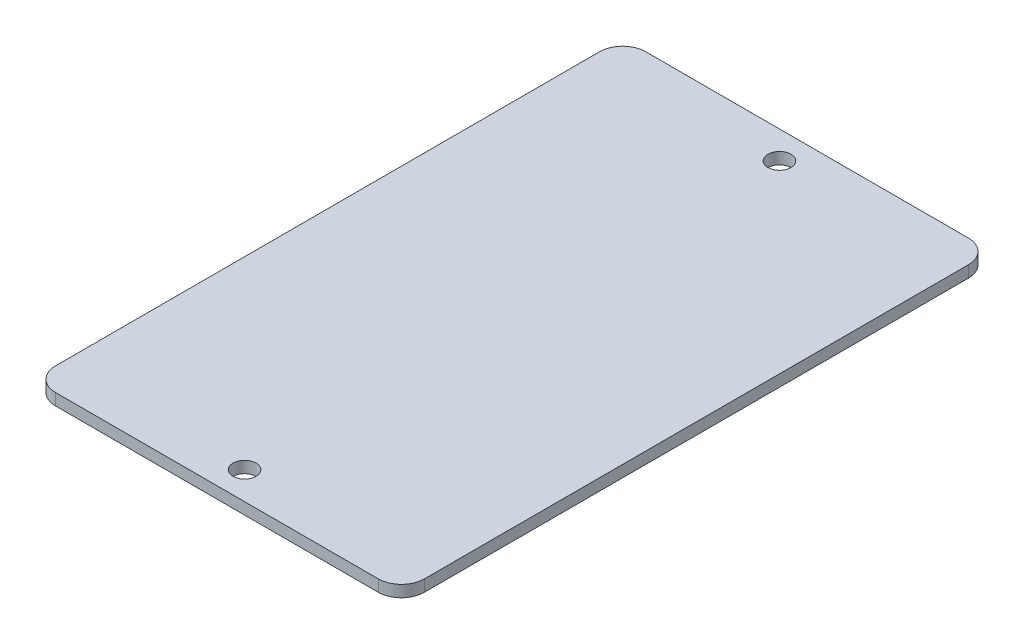
ISO-10303-21;
HEADER;
FILE_DESCRIPTION(('STEP AP214'),'2;1');
FILE_NAME('part.step','',(''),(''),'','','');
FILE_SCHEMA(('AUTOMOTIVE_DESIGN { 1 0 10303 214 1 1 1 1 }'));
ENDSEC;
DATA;
#1=APPLICATION_CONTEXT('core data for automotive mechanical design processes');
#2=APPLICATION_PROTOCOL_DEFINITION('international standard','automotive_design',2000,#1);
#3=PRODUCT_CONTEXT('',#1,'mechanical');
#4=PRODUCT('Part','Part','',(#3));
#5=PRODUCT_RELATED_PRODUCT_CATEGORY('part','',(#4));
#6=PRODUCT_DEFINITION_FORMATION('','',#4);
#7=PRODUCT_DEFINITION_CONTEXT('part definition',#1,'design');
#8=PRODUCT_DEFINITION('design','',#6,#7);
#9=PRODUCT_DEFINITION_SHAPE('','',#8);
#10=(LENGTH_UNIT() NAMED_UNIT(*) SI_UNIT(.MILLI.,.METRE.));
#11=(NAMED_UNIT(*) PLANE_ANGLE_UNIT() SI_UNIT($,.RADIAN.));
#12=(NAMED_UNIT(*) SI_UNIT($,.STERADIAN.) SOLID_ANGLE_UNIT());
#13=UNCERTAINTY_MEASURE_WITH_UNIT(LENGTH_MEASURE(1.E-05),#10,'distance_accuracy_value','');
#14=(GEOMETRIC_REPRESENTATION_CONTEXT(3) GLOBAL_UNCERTAINTY_ASSIGNED_CONTEXT((#13)) GLOBAL_UNIT_ASSIGNED_CONTEXT((#10,
#11,#12)) REPRESENTATION_CONTEXT('',''));
#15=CARTESIAN_POINT('',(0.,0.,0.));
#16=DIRECTION('',(0.,0.,1.));
#17=DIRECTION('',(1.,0.,0.));
#18=AXIS2_PLACEMENT_3D('',#15,#16,#17);
#19=CARTESIAN_POINT('',(25.4,0.8001,40.64));
#20=DIRECTION('',(-1.,0.,0.));
#21=DIRECTION('',(0.,0.,1.));
#22=AXIS2_PLACEMENT_3D('',#19,#20,#21);
#23=PLANE('',#22);
#24=DIRECTION('',(0.,0.,-1.));
#25=VECTOR('',#24,1.);
#26=CARTESIAN_POINT('',(25.4,0.8001,40.64));
#27=LINE('',#26,#25);
#28=CARTESIAN_POINT('',(25.4,0.8001,37.465));
#29=VERTEX_POINT('',#28);
#30=CARTESIAN_POINT('',(25.4,0.8001,-37.465));
#31=VERTEX_POINT('',#30);
#32=EDGE_CURVE('E119',#29,#31,#27,.T.);
#33=ORIENTED_EDGE('',*,*,#32,.F.);
#34=DIRECTION('',(0.,-1.,0.));
#35=VECTOR('',#34,1.);
#36=CARTESIAN_POINT('',(25.4,0.8001,37.465));
#37=LINE('',#36,#35);
#38=CARTESIAN_POINT('',(25.4,-0.8001,37.465));
#39=VERTEX_POINT('',#38);
#40=EDGE_CURVE('E104',#29,#39,#37,.T.);
#41=ORIENTED_EDGE('',*,*,#40,.T.);
#42=DIRECTION('',(0.,0.,-1.));
#43=VECTOR('',#42,1.);
#44=CARTESIAN_POINT('',(25.4,-0.8001,40.64));
#45=LINE('',#44,#43);
#46=CARTESIAN_POINT('',(25.4,-0.8001,-37.465));
#47=VERTEX_POINT('',#46);
#48=EDGE_CURVE('E116',#39,#47,#45,.T.);
#49=ORIENTED_EDGE('',*,*,#48,.T.);
#50=DIRECTION('',(0.,-1.,0.));
#51=VECTOR('',#50,1.);
#52=CARTESIAN_POINT('',(25.4,0.8001,-37.465));
#53=LINE('',#52,#51);
#54=EDGE_CURVE('E121',#47,#31,#53,.F.);
#55=ORIENTED_EDGE('',*,*,#54,.T.);
#56=EDGE_LOOP('',(#33,#41,#49,#55));
#57=FACE_BOUND('',#56,.T.);
#58=ADVANCED_FACE('F33',(#57),#23,.F.);
#59=CARTESIAN_POINT('',(-25.4,0.8001,-40.64));
#60=DIRECTION('',(0.,0.,1.));
#61=DIRECTION('',(1.,0.,0.));
#62=AXIS2_PLACEMENT_3D('',#59,#60,#61);
#63=PLANE('',#62);
#64=DIRECTION('',(-1.,0.,0.));
#65=VECTOR('',#64,1.);
#66=CARTESIAN_POINT('',(-25.4,0.8001,-40.64));
#67=LINE('',#66,#65);
#68=CARTESIAN_POINT('',(22.225,0.8001,-40.64));
#69=VERTEX_POINT('',#68);
#70=CARTESIAN_POINT('',(-22.225,0.8001,-40.64));
#71=VERTEX_POINT('',#70);
#72=EDGE_CURVE('E163',#69,#71,#67,.T.);
#73=ORIENTED_EDGE('',*,*,#72,.F.);
#74=DIRECTION('',(0.,-1.,0.));
#75=VECTOR('',#74,1.);
#76=CARTESIAN_POINT('',(22.225,0.8001,-40.64));
#77=LINE('',#76,#75);
#78=CARTESIAN_POINT('',(22.225,-0.8001,-40.64));
#79=VERTEX_POINT('',#78);
#80=EDGE_CURVE('E11',#69,#79,#77,.T.);
#81=ORIENTED_EDGE('',*,*,#80,.T.);
#82=DIRECTION('',(-1.,0.,0.));
#83=VECTOR('',#82,1.);
#84=CARTESIAN_POINT('',(-25.4,-0.8001,-40.64));
#85=LINE('',#84,#83);
#86=CARTESIAN_POINT('',(-22.225,-0.8001,-40.64));
#87=VERTEX_POINT('',#86);
#88=EDGE_CURVE('E126',#79,#87,#85,.T.);
#89=ORIENTED_EDGE('',*,*,#88,.T.);
#90=DIRECTION('',(0.,-1.,0.));
#91=VECTOR('',#90,1.);
#92=CARTESIAN_POINT('',(-22.225,0.8001,-40.64));
#93=LINE('',#92,#91);
#94=EDGE_CURVE('E41',#87,#71,#93,.F.);
#95=ORIENTED_EDGE('',*,*,#94,.T.);
#96=EDGE_LOOP('',(#73,#81,#89,#95));
#97=FACE_BOUND('',#96,.T.);
#98=ADVANCED_FACE('F162',(#97),#63,.F.);
#99=CARTESIAN_POINT('',(-25.4,0.8001,40.64));
#100=DIRECTION('',(1.,0.,0.));
#101=DIRECTION('',(0.,0.,-1.));
#102=AXIS2_PLACEMENT_3D('',#99,#100,#101);
#103=PLANE('',#102);
#104=DIRECTION('',(0.,0.,1.));
#105=VECTOR('',#104,1.);
#106=CARTESIAN_POINT('',(-25.4,-0.8001,40.64));
#107=LINE('',#106,#105);
#108=CARTESIAN_POINT('',(-25.4,-0.8001,-37.465));
#109=VERTEX_POINT('',#108);
#110=CARTESIAN_POINT('',(-25.4,-0.8001,37.465));
#111=VERTEX_POINT('',#110);
#112=EDGE_CURVE('E130',#109,#111,#107,.T.);
#113=ORIENTED_EDGE('',*,*,#112,.T.);
#114=DIRECTION('',(0.,-1.,0.));
#115=VECTOR('',#114,1.);
#116=CARTESIAN_POINT('',(-25.4,0.8001,37.465));
#117=LINE('',#116,#115);
#118=CARTESIAN_POINT('',(-25.4,0.8001,37.465));
#119=VERTEX_POINT('',#118);
#120=EDGE_CURVE('E48',#111,#119,#117,.F.);
#121=ORIENTED_EDGE('',*,*,#120,.T.);
#122=DIRECTION('',(0.,0.,1.));
#123=VECTOR('',#122,1.);
#124=CARTESIAN_POINT('',(-25.4,0.8001,40.64));
#125=LINE('',#124,#123);
#126=CARTESIAN_POINT('',(-25.4,0.8001,-37.465));
#127=VERTEX_POINT('',#126);
#128=EDGE_CURVE('E169',#127,#119,#125,.T.);
#129=ORIENTED_EDGE('',*,*,#128,.F.);
#130=DIRECTION('',(0.,-1.,0.));
#131=VECTOR('',#130,1.);
#132=CARTESIAN_POINT('',(-25.4,0.8001,-37.465));
#133=LINE('',#132,#131);
#134=EDGE_CURVE('E156',#127,#109,#133,.T.);
#135=ORIENTED_EDGE('',*,*,#134,.T.);
#136=EDGE_LOOP('',(#113,#121,#129,#135));
#137=FACE_BOUND('',#136,.T.);
#138=ADVANCED_FACE('F173',(#137),#103,.F.);
#139=CARTESIAN_POINT('',(-25.4,0.8001,40.64));
#140=DIRECTION('',(0.,0.,-1.));
#141=DIRECTION('',(-1.,0.,0.));
#142=AXIS2_PLACEMENT_3D('',#139,#140,#141);
#143=PLANE('',#142);
#144=DIRECTION('',(1.,0.,0.));
#145=VECTOR('',#144,1.);
#146=CARTESIAN_POINT('',(-25.4,-0.8001,40.64));
#147=LINE('',#146,#145);
#148=CARTESIAN_POINT('',(-22.225,-0.8001,40.64));
#149=VERTEX_POINT('',#148);
#150=CARTESIAN_POINT('',(22.225,-0.8001,40.64));
#151=VERTEX_POINT('',#150);
#152=EDGE_CURVE('E140',#149,#151,#147,.T.);
#153=ORIENTED_EDGE('',*,*,#152,.T.);
#154=DIRECTION('',(0.,-1.,0.));
#155=VECTOR('',#154,1.);
#156=CARTESIAN_POINT('',(22.225,0.8001,40.64));
#157=LINE('',#156,#155);
#158=CARTESIAN_POINT('',(22.225,0.8001,40.64));
#159=VERTEX_POINT('',#158);
#160=EDGE_CURVE('E105',#151,#159,#157,.F.);
#161=ORIENTED_EDGE('',*,*,#160,.T.);
#162=DIRECTION('',(1.,0.,0.));
#163=VECTOR('',#162,1.);
#164=CARTESIAN_POINT('',(-25.4,0.8001,40.64));
#165=LINE('',#164,#163);
#166=CARTESIAN_POINT('',(-22.225,0.8001,40.64));
#167=VERTEX_POINT('',#166);
#168=EDGE_CURVE('E136',#167,#159,#165,.T.);
#169=ORIENTED_EDGE('',*,*,#168,.F.);
#170=DIRECTION('',(0.,-1.,0.));
#171=VECTOR('',#170,1.);
#172=CARTESIAN_POINT('',(-22.225,0.8001,40.64));
#173=LINE('',#172,#171);
#174=EDGE_CURVE('E110',#167,#149,#173,.T.);
#175=ORIENTED_EDGE('',*,*,#174,.T.);
#176=EDGE_LOOP('',(#153,#161,#169,#175));
#177=FACE_BOUND('',#176,.T.);
#178=ADVANCED_FACE('F180',(#177),#143,.F.);
#179=CARTESIAN_POINT('',(0.,0.8001,0.));
#180=DIRECTION('',(0.,-1.,0.));
#181=DIRECTION('',(0.,0.,-1.));
#182=AXIS2_PLACEMENT_3D('',#179,#180,#181);
#183=PLANE('',#182);
#184=CARTESIAN_POINT('',(0.,0.8001,36.83));
#185=DIRECTION('',(0.,1.,0.));
#186=DIRECTION('',(0.,0.,1.));
#187=AXIS2_PLACEMENT_3D('',#184,#185,#186);
#188=CIRCLE('',#187,1.5875);
#189=CARTESIAN_POINT('',(0.,0.8001,38.4175));
#190=VERTEX_POINT('',#189);
#191=EDGE_CURVE('E133',#190,#190,#188,.T.);
#192=ORIENTED_EDGE('',*,*,#191,.F.);
#193=EDGE_LOOP('',(#192));
#194=FACE_BOUND('',#193,.T.);
#195=CARTESIAN_POINT('',(0.,0.8001,-36.83));
#196=DIRECTION('',(0.,1.,0.));
#197=DIRECTION('',(0.,0.,1.));
#198=AXIS2_PLACEMENT_3D('',#195,#196,#197);
#199=CIRCLE('',#198,1.5875);
#200=CARTESIAN_POINT('',(0.,0.8001,-35.2425));
#201=VERTEX_POINT('',#200);
#202=EDGE_CURVE('E183',#201,#201,#199,.T.);
#203=ORIENTED_EDGE('',*,*,#202,.F.);
#204=EDGE_LOOP('',(#203));
#205=FACE_BOUND('',#204,.T.);
#206=ORIENTED_EDGE('',*,*,#168,.T.);
#207=CARTESIAN_POINT('',(22.225,0.8001,37.465));
#208=DIRECTION('',(0.,-1.,0.));
#209=DIRECTION('',(0.,0.,-1.));
#210=AXIS2_PLACEMENT_3D('',#207,#208,#209);
#211=CIRCLE('',#210,3.175);
#212=EDGE_CURVE('E154',#159,#29,#211,.F.);
#213=ORIENTED_EDGE('',*,*,#212,.T.);
#214=ORIENTED_EDGE('',*,*,#32,.T.);
#215=CARTESIAN_POINT('',(22.225,0.8001,-37.465));
#216=DIRECTION('',(0.,-1.,0.));
#217=DIRECTION('',(0.,0.,-1.));
#218=AXIS2_PLACEMENT_3D('',#215,#216,#217);
#219=CIRCLE('',#218,3.175);
#220=EDGE_CURVE('E150',#31,#69,#219,.F.);
#221=ORIENTED_EDGE('',*,*,#220,.T.);
#222=ORIENTED_EDGE('',*,*,#72,.T.);
#223=CARTESIAN_POINT('',(-22.225,0.8001,-37.465));
#224=DIRECTION('',(0.,-1.,0.));
#225=DIRECTION('',(0.,0.,-1.));
#226=AXIS2_PLACEMENT_3D('',#223,#224,#225);
#227=CIRCLE('',#226,3.175);
#228=EDGE_CURVE('E55',#71,#127,#227,.F.);
#229=ORIENTED_EDGE('',*,*,#228,.T.);
#230=ORIENTED_EDGE('',*,*,#128,.T.);
#231=CARTESIAN_POINT('',(-22.225,0.8001,37.465));
#232=DIRECTION('',(0.,-1.,0.));
#233=DIRECTION('',(0.,0.,-1.));
#234=AXIS2_PLACEMENT_3D('',#231,#232,#233);
#235=CIRCLE('',#234,3.175);
#236=EDGE_CURVE('E152',#119,#167,#235,.F.);
#237=ORIENTED_EDGE('',*,*,#236,.T.);
#238=EDGE_LOOP('',(#206,#213,#214,#221,#222,#229,#230,#237));
#239=FACE_BOUND('',#238,.T.);
#240=ADVANCED_FACE('F167',(#194,#205,#239),#183,.F.);
#241=CARTESIAN_POINT('',(0.,-0.8001,0.));
#242=DIRECTION('',(0.,-1.,0.));
#243=DIRECTION('',(0.,0.,-1.));
#244=AXIS2_PLACEMENT_3D('',#241,#242,#243);
#245=PLANE('',#244);
#246=CARTESIAN_POINT('',(0.,-0.8001,36.83));
#247=DIRECTION('',(0.,1.,0.));
#248=DIRECTION('',(0.,0.,1.));
#249=AXIS2_PLACEMENT_3D('',#246,#247,#248);
#250=CIRCLE('',#249,1.5875);
#251=CARTESIAN_POINT('',(0.,-0.8001,38.4175));
#252=VERTEX_POINT('',#251);
#253=EDGE_CURVE('E127',#252,#252,#250,.T.);
#254=ORIENTED_EDGE('',*,*,#253,.T.);
#255=EDGE_LOOP('',(#254));
#256=FACE_BOUND('',#255,.T.);
#257=CARTESIAN_POINT('',(0.,-0.8001,-36.83));
#258=DIRECTION('',(0.,1.,0.));
#259=DIRECTION('',(0.,0.,1.));
#260=AXIS2_PLACEMENT_3D('',#257,#258,#259);
#261=CIRCLE('',#260,1.5875);
#262=CARTESIAN_POINT('',(0.,-0.8001,-35.2425));
#263=VERTEX_POINT('',#262);
#264=EDGE_CURVE('E186',#263,#263,#261,.T.);
#265=ORIENTED_EDGE('',*,*,#264,.T.);
#266=EDGE_LOOP('',(#265));
#267=FACE_BOUND('',#266,.T.);
#268=ORIENTED_EDGE('',*,*,#48,.F.);
#269=CARTESIAN_POINT('',(22.225,-0.8001,37.465));
#270=DIRECTION('',(0.,-1.,0.));
#271=DIRECTION('',(0.,0.,-1.));
#272=AXIS2_PLACEMENT_3D('',#269,#270,#271);
#273=CIRCLE('',#272,3.175);
#274=EDGE_CURVE('E100',#39,#151,#273,.T.);
#275=ORIENTED_EDGE('',*,*,#274,.T.);
#276=ORIENTED_EDGE('',*,*,#152,.F.);
#277=CARTESIAN_POINT('',(-22.225,-0.8001,37.465));
#278=DIRECTION('',(0.,-1.,0.));
#279=DIRECTION('',(0.,0.,-1.));
#280=AXIS2_PLACEMENT_3D('',#277,#278,#279);
#281=CIRCLE('',#280,3.175);
#282=EDGE_CURVE('E111',#149,#111,#281,.T.);
#283=ORIENTED_EDGE('',*,*,#282,.T.);
#284=ORIENTED_EDGE('',*,*,#112,.F.);
#285=CARTESIAN_POINT('',(-22.225,-0.8001,-37.465));
#286=DIRECTION('',(0.,-1.,0.));
#287=DIRECTION('',(0.,0.,-1.));
#288=AXIS2_PLACEMENT_3D('',#285,#286,#287);
#289=CIRCLE('',#288,3.175);
#290=EDGE_CURVE('E120',#109,#87,#289,.T.);
#291=ORIENTED_EDGE('',*,*,#290,.T.);
#292=ORIENTED_EDGE('',*,*,#88,.F.);
#293=CARTESIAN_POINT('',(22.225,-0.8001,-37.465));
#294=DIRECTION('',(0.,-1.,0.));
#295=DIRECTION('',(0.,0.,-1.));
#296=AXIS2_PLACEMENT_3D('',#293,#294,#295);
#297=CIRCLE('',#296,3.175);
#298=EDGE_CURVE('E125',#79,#47,#297,.T.);
#299=ORIENTED_EDGE('',*,*,#298,.T.);
#300=EDGE_LOOP('',(#268,#275,#276,#283,#284,#291,#292,#299));
#301=FACE_BOUND('',#300,.T.);
#302=ADVANCED_FACE('F123',(#256,#267,#301),#245,.T.);
#303=CARTESIAN_POINT('',(0.,-0.8001,-36.83));
#304=DIRECTION('',(0.,1.,0.));
#305=DIRECTION('',(0.,0.,1.));
#306=AXIS2_PLACEMENT_3D('',#303,#304,#305);
#307=CYLINDRICAL_SURFACE('',#306,1.5875);
#308=ORIENTED_EDGE('',*,*,#264,.F.);
#309=EDGE_LOOP('',(#308));
#310=FACE_BOUND('',#309,.T.);
#311=ORIENTED_EDGE('',*,*,#202,.T.);
#312=EDGE_LOOP('',(#311));
#313=FACE_BOUND('',#312,.T.);
#314=ADVANCED_FACE('F199',(#310,#313),#307,.F.);
#315=CARTESIAN_POINT('',(0.,-0.8001,36.83));
#316=DIRECTION('',(0.,1.,0.));
#317=DIRECTION('',(0.,0.,1.));
#318=AXIS2_PLACEMENT_3D('',#315,#316,#317);
#319=CYLINDRICAL_SURFACE('',#318,1.5875);
#320=ORIENTED_EDGE('',*,*,#253,.F.);
#321=EDGE_LOOP('',(#320));
#322=FACE_BOUND('',#321,.T.);
#323=ORIENTED_EDGE('',*,*,#191,.T.);
#324=EDGE_LOOP('',(#323));
#325=FACE_BOUND('',#324,.T.);
#326=ADVANCED_FACE('F192',(#322,#325),#319,.F.);
#327=CARTESIAN_POINT('',(22.225,0.8001,37.465));
#328=DIRECTION('',(0.,-1.,0.));
#329=DIRECTION('',(0.,0.,-1.));
#330=AXIS2_PLACEMENT_3D('',#327,#328,#329);
#331=CYLINDRICAL_SURFACE('',#330,3.175);
#332=ORIENTED_EDGE('',*,*,#212,.F.);
#333=ORIENTED_EDGE('',*,*,#160,.F.);
#334=ORIENTED_EDGE('',*,*,#274,.F.);
#335=ORIENTED_EDGE('',*,*,#40,.F.);
#336=EDGE_LOOP('',(#332,#333,#334,#335));
#337=FACE_BOUND('',#336,.T.);
#338=ADVANCED_FACE('F103',(#337),#331,.T.);
#339=CARTESIAN_POINT('',(-22.225,0.8001,37.465));
#340=DIRECTION('',(0.,-1.,0.));
#341=DIRECTION('',(0.,0.,-1.));
#342=AXIS2_PLACEMENT_3D('',#339,#340,#341);
#343=CYLINDRICAL_SURFACE('',#342,3.175);
#344=ORIENTED_EDGE('',*,*,#236,.F.);
#345=ORIENTED_EDGE('',*,*,#120,.F.);
#346=ORIENTED_EDGE('',*,*,#282,.F.);
#347=ORIENTED_EDGE('',*,*,#174,.F.);
#348=EDGE_LOOP('',(#344,#345,#346,#347));
#349=FACE_BOUND('',#348,.T.);
#350=ADVANCED_FACE('F177',(#349),#343,.T.);
#351=CARTESIAN_POINT('',(22.225,0.8001,-37.465));
#352=DIRECTION('',(0.,-1.,0.));
#353=DIRECTION('',(0.,0.,-1.));
#354=AXIS2_PLACEMENT_3D('',#351,#352,#353);
#355=CYLINDRICAL_SURFACE('',#354,3.175);
#356=ORIENTED_EDGE('',*,*,#220,.F.);
#357=ORIENTED_EDGE('',*,*,#54,.F.);
#358=ORIENTED_EDGE('',*,*,#298,.F.);
#359=ORIENTED_EDGE('',*,*,#80,.F.);
#360=EDGE_LOOP('',(#356,#357,#358,#359));
#361=FACE_BOUND('',#360,.T.);
#362=ADVANCED_FACE('F223',(#361),#355,.T.);
#363=CARTESIAN_POINT('',(-22.225,0.8001,-37.465));
#364=DIRECTION('',(0.,-1.,0.));
#365=DIRECTION('',(0.,0.,-1.));
#366=AXIS2_PLACEMENT_3D('',#363,#364,#365);
#367=CYLINDRICAL_SURFACE('',#366,3.175);
#368=ORIENTED_EDGE('',*,*,#228,.F.);
#369=ORIENTED_EDGE('',*,*,#94,.F.);
#370=ORIENTED_EDGE('',*,*,#290,.F.);
#371=ORIENTED_EDGE('',*,*,#134,.F.);
#372=EDGE_LOOP('',(#368,#369,#370,#371));
#373=FACE_BOUND('',#372,.T.);
#374=ADVANCED_FACE('F35',(#373),#367,.T.);
#375=CLOSED_SHELL('',(#58,#98,#138,#178,#240,#302,#314,#326,#338,#350,#362,#374));
#376=MANIFOLD_SOLID_BREP('B2',#375);
#377=ADVANCED_BREP_SHAPE_REPRESENTATION('',(#18,#376),#14);
#378=SHAPE_DEFINITION_REPRESENTATION(#9,#377);
ENDSEC;
END-ISO-10303-21;
